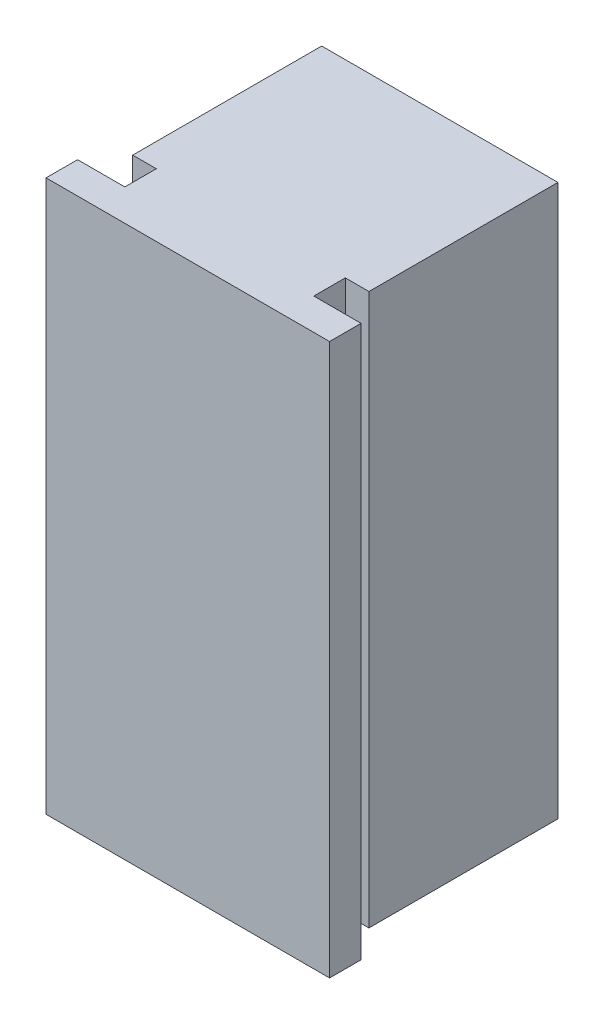
ISO-10303-21;
HEADER;
FILE_DESCRIPTION(('STEP AP214'),'2;1');
FILE_NAME('part.step','',(''),(''),'','','');
FILE_SCHEMA(('AUTOMOTIVE_DESIGN { 1 0 10303 214 1 1 1 1 }'));
ENDSEC;
DATA;
#1=APPLICATION_CONTEXT('core data for automotive mechanical design processes');
#2=APPLICATION_PROTOCOL_DEFINITION('international standard','automotive_design',2000,#1);
#3=PRODUCT_CONTEXT('',#1,'mechanical');
#4=PRODUCT('Part','Part','',(#3));
#5=PRODUCT_RELATED_PRODUCT_CATEGORY('part','',(#4));
#6=PRODUCT_DEFINITION_FORMATION('','',#4);
#7=PRODUCT_DEFINITION_CONTEXT('part definition',#1,'design');
#8=PRODUCT_DEFINITION('design','',#6,#7);
#9=PRODUCT_DEFINITION_SHAPE('','',#8);
#10=(LENGTH_UNIT() NAMED_UNIT(*) SI_UNIT(.MILLI.,.METRE.));
#11=(NAMED_UNIT(*) PLANE_ANGLE_UNIT() SI_UNIT($,.RADIAN.));
#12=(NAMED_UNIT(*) SI_UNIT($,.STERADIAN.) SOLID_ANGLE_UNIT());
#13=UNCERTAINTY_MEASURE_WITH_UNIT(LENGTH_MEASURE(1.E-05),#10,'distance_accuracy_value','');
#14=(GEOMETRIC_REPRESENTATION_CONTEXT(3) GLOBAL_UNCERTAINTY_ASSIGNED_CONTEXT((#13)) GLOBAL_UNIT_ASSIGNED_CONTEXT((#10,
#11,#12)) REPRESENTATION_CONTEXT('',''));
#15=CARTESIAN_POINT('',(0.,0.,0.));
#16=DIRECTION('',(0.,0.,1.));
#17=DIRECTION('',(1.,0.,0.));
#18=AXIS2_PLACEMENT_3D('',#15,#16,#17);
#19=CARTESIAN_POINT('',(0.,35.,3.16129032258062));
#20=DIRECTION('',(0.,0.,-1.));
#21=DIRECTION('',(-1.,0.,0.));
#22=AXIS2_PLACEMENT_3D('',#19,#20,#21);
#23=PLANE('',#22);
#24=CARTESIAN_POINT('',(8.9354838709677,17.5,3.16129032258062));
#25=DIRECTION('',(0.,0.,-1.));
#26=DIRECTION('',(-1.,0.,0.));
#27=AXIS2_PLACEMENT_3D('',#24,#25,#26);
#28=CIRCLE('',#27,4.5);
#29=CARTESIAN_POINT('',(4.4354838709677,17.5,3.16129032258062));
#30=VERTEX_POINT('',#29);
#31=EDGE_CURVE('E253',#30,#30,#28,.T.);
#32=ORIENTED_EDGE('',*,*,#31,.F.);
#33=EDGE_LOOP('',(#32));
#34=FACE_BOUND('',#33,.T.);
#35=DIRECTION('',(1.,0.,0.));
#36=VECTOR('',#35,1.);
#37=CARTESIAN_POINT('',(0.,0.,3.16129032258062));
#38=LINE('',#37,#36);
#39=CARTESIAN_POINT('',(1.4354838709677,0.,3.16129032258062));
#40=VERTEX_POINT('',#39);
#41=CARTESIAN_POINT('',(16.4354838709677,0.,3.16129032258062));
#42=VERTEX_POINT('',#41);
#43=EDGE_CURVE('E161',#40,#42,#38,.T.);
#44=ORIENTED_EDGE('',*,*,#43,.F.);
#45=DIRECTION('',(0.,-1.,0.));
#46=VECTOR('',#45,1.);
#47=CARTESIAN_POINT('',(1.4354838709677,35.,3.16129032258062));
#48=LINE('',#47,#46);
#49=CARTESIAN_POINT('',(1.4354838709677,35.,3.16129032258062));
#50=VERTEX_POINT('',#49);
#51=EDGE_CURVE('E11',#50,#40,#48,.T.);
#52=ORIENTED_EDGE('',*,*,#51,.F.);
#53=DIRECTION('',(1.,0.,0.));
#54=VECTOR('',#53,1.);
#55=CARTESIAN_POINT('',(0.,35.,3.16129032258062));
#56=LINE('',#55,#54);
#57=CARTESIAN_POINT('',(16.4354838709677,35.,3.16129032258062));
#58=VERTEX_POINT('',#57);
#59=EDGE_CURVE('E204',#50,#58,#56,.T.);
#60=ORIENTED_EDGE('',*,*,#59,.T.);
#61=DIRECTION('',(0.,-1.,0.));
#62=VECTOR('',#61,1.);
#63=CARTESIAN_POINT('',(16.4354838709677,35.,3.16129032258062));
#64=LINE('',#63,#62);
#65=EDGE_CURVE('E105',#58,#42,#64,.T.);
#66=ORIENTED_EDGE('',*,*,#65,.T.);
#67=EDGE_LOOP('',(#44,#52,#60,#66));
#68=FACE_BOUND('',#67,.T.);
#69=ADVANCED_FACE('F41',(#34,#68),#23,.T.);
#70=CARTESIAN_POINT('',(1.4354838709677,35.,0.));
#71=DIRECTION('',(-1.,0.,0.));
#72=DIRECTION('',(0.,0.,1.));
#73=AXIS2_PLACEMENT_3D('',#70,#71,#72);
#74=PLANE('',#73);
#75=DIRECTION('',(0.,0.,-1.));
#76=VECTOR('',#75,1.);
#77=CARTESIAN_POINT('',(1.4354838709677,0.,0.));
#78=LINE('',#77,#76);
#79=CARTESIAN_POINT('',(1.43548387096771,0.,15.1612903225806));
#80=VERTEX_POINT('',#79);
#81=EDGE_CURVE('E165',#80,#40,#78,.T.);
#82=ORIENTED_EDGE('',*,*,#81,.F.);
#83=DIRECTION('',(0.,-1.,0.));
#84=VECTOR('',#83,1.);
#85=CARTESIAN_POINT('',(1.43548387096771,35.,15.1612903225806));
#86=LINE('',#85,#84);
#87=CARTESIAN_POINT('',(1.43548387096771,35.,15.1612903225806));
#88=VERTEX_POINT('',#87);
#89=EDGE_CURVE('E50',#88,#80,#86,.T.);
#90=ORIENTED_EDGE('',*,*,#89,.F.);
#91=DIRECTION('',(0.,0.,-1.));
#92=VECTOR('',#91,1.);
#93=CARTESIAN_POINT('',(1.4354838709677,35.,0.));
#94=LINE('',#93,#92);
#95=EDGE_CURVE('E244',#88,#50,#94,.T.);
#96=ORIENTED_EDGE('',*,*,#95,.T.);
#97=ORIENTED_EDGE('',*,*,#51,.T.);
#98=EDGE_LOOP('',(#82,#90,#96,#97));
#99=FACE_BOUND('',#98,.T.);
#100=ADVANCED_FACE('F243',(#99),#74,.T.);
#101=CARTESIAN_POINT('',(0.,35.,15.1612903225806));
#102=DIRECTION('',(0.,0.,-1.));
#103=DIRECTION('',(-1.,0.,0.));
#104=AXIS2_PLACEMENT_3D('',#101,#102,#103);
#105=PLANE('',#104);
#106=DIRECTION('',(1.,0.,0.));
#107=VECTOR('',#106,1.);
#108=CARTESIAN_POINT('',(0.,0.,15.1612903225806));
#109=LINE('',#108,#107);
#110=CARTESIAN_POINT('',(2.93548387096771,0.,15.1612903225806));
#111=VERTEX_POINT('',#110);
#112=EDGE_CURVE('E170',#80,#111,#109,.T.);
#113=ORIENTED_EDGE('',*,*,#112,.T.);
#114=DIRECTION('',(0.,-1.,0.));
#115=VECTOR('',#114,1.);
#116=CARTESIAN_POINT('',(2.93548387096771,35.,15.1612903225806));
#117=LINE('',#116,#115);
#118=CARTESIAN_POINT('',(2.93548387096771,35.,15.1612903225806));
#119=VERTEX_POINT('',#118);
#120=EDGE_CURVE('E227',#119,#111,#117,.T.);
#121=ORIENTED_EDGE('',*,*,#120,.F.);
#122=DIRECTION('',(1.,0.,0.));
#123=VECTOR('',#122,1.);
#124=CARTESIAN_POINT('',(0.,35.,15.1612903225806));
#125=LINE('',#124,#123);
#126=EDGE_CURVE('E235',#88,#119,#125,.T.);
#127=ORIENTED_EDGE('',*,*,#126,.F.);
#128=ORIENTED_EDGE('',*,*,#89,.T.);
#129=EDGE_LOOP('',(#113,#121,#127,#128));
#130=FACE_BOUND('',#129,.T.);
#131=ADVANCED_FACE('F233',(#130),#105,.F.);
#132=CARTESIAN_POINT('',(2.93548387096771,35.,0.));
#133=DIRECTION('',(-1.,0.,0.));
#134=DIRECTION('',(0.,0.,1.));
#135=AXIS2_PLACEMENT_3D('',#132,#133,#134);
#136=PLANE('',#135);
#137=DIRECTION('',(0.,0.,-1.));
#138=VECTOR('',#137,1.);
#139=CARTESIAN_POINT('',(2.93548387096771,0.,0.));
#140=LINE('',#139,#138);
#141=CARTESIAN_POINT('',(2.93548387096771,0.,17.1612903225806));
#142=VERTEX_POINT('',#141);
#143=EDGE_CURVE('E174',#142,#111,#140,.T.);
#144=ORIENTED_EDGE('',*,*,#143,.F.);
#145=DIRECTION('',(0.,-1.,0.));
#146=VECTOR('',#145,1.);
#147=CARTESIAN_POINT('',(2.93548387096771,35.,17.1612903225806));
#148=LINE('',#147,#146);
#149=CARTESIAN_POINT('',(2.93548387096771,35.,17.1612903225806));
#150=VERTEX_POINT('',#149);
#151=EDGE_CURVE('E224',#150,#142,#148,.T.);
#152=ORIENTED_EDGE('',*,*,#151,.F.);
#153=DIRECTION('',(0.,0.,-1.));
#154=VECTOR('',#153,1.);
#155=CARTESIAN_POINT('',(2.93548387096771,35.,0.));
#156=LINE('',#155,#154);
#157=EDGE_CURVE('E258',#150,#119,#156,.T.);
#158=ORIENTED_EDGE('',*,*,#157,.T.);
#159=ORIENTED_EDGE('',*,*,#120,.T.);
#160=EDGE_LOOP('',(#144,#152,#158,#159));
#161=FACE_BOUND('',#160,.T.);
#162=ADVANCED_FACE('F299',(#161),#136,.T.);
#163=CARTESIAN_POINT('',(0.,35.,17.1612903225806));
#164=DIRECTION('',(0.,0.,-1.));
#165=DIRECTION('',(-1.,0.,0.));
#166=AXIS2_PLACEMENT_3D('',#163,#164,#165);
#167=PLANE('',#166);
#168=DIRECTION('',(1.,0.,0.));
#169=VECTOR('',#168,1.);
#170=CARTESIAN_POINT('',(0.,0.,17.1612903225806));
#171=LINE('',#170,#169);
#172=CARTESIAN_POINT('',(-0.0645161290322924,0.,17.1612903225806));
#173=VERTEX_POINT('',#172);
#174=EDGE_CURVE('E178',#173,#142,#171,.T.);
#175=ORIENTED_EDGE('',*,*,#174,.F.);
#176=DIRECTION('',(0.,-1.,0.));
#177=VECTOR('',#176,1.);
#178=CARTESIAN_POINT('',(-0.0645161290322924,35.,17.1612903225806));
#179=LINE('',#178,#177);
#180=CARTESIAN_POINT('',(-0.0645161290322924,35.,17.1612903225806));
#181=VERTEX_POINT('',#180);
#182=EDGE_CURVE('E221',#181,#173,#179,.T.);
#183=ORIENTED_EDGE('',*,*,#182,.F.);
#184=DIRECTION('',(1.,0.,0.));
#185=VECTOR('',#184,1.);
#186=CARTESIAN_POINT('',(0.,35.,17.1612903225806));
#187=LINE('',#186,#185);
#188=EDGE_CURVE('E262',#181,#150,#187,.T.);
#189=ORIENTED_EDGE('',*,*,#188,.T.);
#190=ORIENTED_EDGE('',*,*,#151,.T.);
#191=EDGE_LOOP('',(#175,#183,#189,#190));
#192=FACE_BOUND('',#191,.T.);
#193=ADVANCED_FACE('F295',(#192),#167,.T.);
#194=CARTESIAN_POINT('',(-0.0645161290322924,35.,0.));
#195=DIRECTION('',(-1.,0.,0.));
#196=DIRECTION('',(0.,0.,1.));
#197=AXIS2_PLACEMENT_3D('',#194,#195,#196);
#198=PLANE('',#197);
#199=DIRECTION('',(0.,0.,-1.));
#200=VECTOR('',#199,1.);
#201=CARTESIAN_POINT('',(-0.0645161290322924,0.,0.));
#202=LINE('',#201,#200);
#203=CARTESIAN_POINT('',(-0.0645161290322924,0.,19.1612903225806));
#204=VERTEX_POINT('',#203);
#205=EDGE_CURVE('E182',#204,#173,#202,.T.);
#206=ORIENTED_EDGE('',*,*,#205,.F.);
#207=DIRECTION('',(0.,-1.,0.));
#208=VECTOR('',#207,1.);
#209=CARTESIAN_POINT('',(-0.0645161290322924,35.,19.1612903225806));
#210=LINE('',#209,#208);
#211=CARTESIAN_POINT('',(-0.0645161290322924,35.,19.1612903225806));
#212=VERTEX_POINT('',#211);
#213=EDGE_CURVE('E218',#212,#204,#210,.T.);
#214=ORIENTED_EDGE('',*,*,#213,.F.);
#215=DIRECTION('',(0.,0.,-1.));
#216=VECTOR('',#215,1.);
#217=CARTESIAN_POINT('',(-0.0645161290322924,35.,0.));
#218=LINE('',#217,#216);
#219=EDGE_CURVE('E266',#212,#181,#218,.T.);
#220=ORIENTED_EDGE('',*,*,#219,.T.);
#221=ORIENTED_EDGE('',*,*,#182,.T.);
#222=EDGE_LOOP('',(#206,#214,#220,#221));
#223=FACE_BOUND('',#222,.T.);
#224=ADVANCED_FACE('F292',(#223),#198,.T.);
#225=CARTESIAN_POINT('',(0.,35.,19.1612903225806));
#226=DIRECTION('',(0.,0.,-1.));
#227=DIRECTION('',(-1.,0.,0.));
#228=AXIS2_PLACEMENT_3D('',#225,#226,#227);
#229=PLANE('',#228);
#230=DIRECTION('',(1.,0.,0.));
#231=VECTOR('',#230,1.);
#232=CARTESIAN_POINT('',(0.,0.,19.1612903225806));
#233=LINE('',#232,#231);
#234=CARTESIAN_POINT('',(17.9354838709677,0.,19.1612903225806));
#235=VERTEX_POINT('',#234);
#236=EDGE_CURVE('E186',#204,#235,#233,.T.);
#237=ORIENTED_EDGE('',*,*,#236,.T.);
#238=DIRECTION('',(0.,-1.,0.));
#239=VECTOR('',#238,1.);
#240=CARTESIAN_POINT('',(17.9354838709677,35.,19.1612903225806));
#241=LINE('',#240,#239);
#242=CARTESIAN_POINT('',(17.9354838709677,35.,19.1612903225806));
#243=VERTEX_POINT('',#242);
#244=EDGE_CURVE('E214',#243,#235,#241,.T.);
#245=ORIENTED_EDGE('',*,*,#244,.F.);
#246=DIRECTION('',(1.,0.,0.));
#247=VECTOR('',#246,1.);
#248=CARTESIAN_POINT('',(0.,35.,19.1612903225806));
#249=LINE('',#248,#247);
#250=EDGE_CURVE('E270',#212,#243,#249,.T.);
#251=ORIENTED_EDGE('',*,*,#250,.F.);
#252=ORIENTED_EDGE('',*,*,#213,.T.);
#253=EDGE_LOOP('',(#237,#245,#251,#252));
#254=FACE_BOUND('',#253,.T.);
#255=ADVANCED_FACE('F289',(#254),#229,.F.);
#256=CARTESIAN_POINT('',(17.9354838709677,35.,0.));
#257=DIRECTION('',(-1.,0.,0.));
#258=DIRECTION('',(0.,0.,1.));
#259=AXIS2_PLACEMENT_3D('',#256,#257,#258);
#260=PLANE('',#259);
#261=DIRECTION('',(0.,0.,-1.));
#262=VECTOR('',#261,1.);
#263=CARTESIAN_POINT('',(17.9354838709677,0.,0.));
#264=LINE('',#263,#262);
#265=CARTESIAN_POINT('',(17.9354838709677,0.,17.1612903225806));
#266=VERTEX_POINT('',#265);
#267=EDGE_CURVE('E189',#235,#266,#264,.T.);
#268=ORIENTED_EDGE('',*,*,#267,.T.);
#269=DIRECTION('',(0.,-1.,0.));
#270=VECTOR('',#269,1.);
#271=CARTESIAN_POINT('',(17.9354838709677,35.,17.1612903225806));
#272=LINE('',#271,#270);
#273=CARTESIAN_POINT('',(17.9354838709677,35.,17.1612903225806));
#274=VERTEX_POINT('',#273);
#275=EDGE_CURVE('E211',#274,#266,#272,.T.);
#276=ORIENTED_EDGE('',*,*,#275,.F.);
#277=DIRECTION('',(0.,0.,-1.));
#278=VECTOR('',#277,1.);
#279=CARTESIAN_POINT('',(17.9354838709677,35.,0.));
#280=LINE('',#279,#278);
#281=EDGE_CURVE('E273',#243,#274,#280,.T.);
#282=ORIENTED_EDGE('',*,*,#281,.F.);
#283=ORIENTED_EDGE('',*,*,#244,.T.);
#284=EDGE_LOOP('',(#268,#276,#282,#283));
#285=FACE_BOUND('',#284,.T.);
#286=ADVANCED_FACE('F284',(#285),#260,.F.);
#287=CARTESIAN_POINT('',(0.,35.,17.1612903225806));
#288=DIRECTION('',(0.,0.,-1.));
#289=DIRECTION('',(-1.,0.,0.));
#290=AXIS2_PLACEMENT_3D('',#287,#288,#289);
#291=PLANE('',#290);
#292=DIRECTION('',(1.,0.,0.));
#293=VECTOR('',#292,1.);
#294=CARTESIAN_POINT('',(0.,0.,17.1612903225806));
#295=LINE('',#294,#293);
#296=CARTESIAN_POINT('',(14.9354838709677,0.,17.1612903225806));
#297=VERTEX_POINT('',#296);
#298=EDGE_CURVE('E193',#297,#266,#295,.T.);
#299=ORIENTED_EDGE('',*,*,#298,.F.);
#300=DIRECTION('',(0.,-1.,0.));
#301=VECTOR('',#300,1.);
#302=CARTESIAN_POINT('',(14.9354838709677,35.,17.1612903225806));
#303=LINE('',#302,#301);
#304=CARTESIAN_POINT('',(14.9354838709677,35.,17.1612903225806));
#305=VERTEX_POINT('',#304);
#306=EDGE_CURVE('E151',#305,#297,#303,.T.);
#307=ORIENTED_EDGE('',*,*,#306,.F.);
#308=DIRECTION('',(1.,0.,0.));
#309=VECTOR('',#308,1.);
#310=CARTESIAN_POINT('',(0.,35.,17.1612903225806));
#311=LINE('',#310,#309);
#312=EDGE_CURVE('E142',#305,#274,#311,.T.);
#313=ORIENTED_EDGE('',*,*,#312,.T.);
#314=ORIENTED_EDGE('',*,*,#275,.T.);
#315=EDGE_LOOP('',(#299,#307,#313,#314));
#316=FACE_BOUND('',#315,.T.);
#317=ADVANCED_FACE('F278',(#316),#291,.T.);
#318=CARTESIAN_POINT('',(14.9354838709677,35.,0.));
#319=DIRECTION('',(-1.,0.,0.));
#320=DIRECTION('',(0.,0.,1.));
#321=AXIS2_PLACEMENT_3D('',#318,#319,#320);
#322=PLANE('',#321);
#323=DIRECTION('',(0.,0.,-1.));
#324=VECTOR('',#323,1.);
#325=CARTESIAN_POINT('',(14.9354838709677,0.,0.));
#326=LINE('',#325,#324);
#327=CARTESIAN_POINT('',(14.9354838709677,0.,15.1612903225806));
#328=VERTEX_POINT('',#327);
#329=EDGE_CURVE('E149',#297,#328,#326,.T.);
#330=ORIENTED_EDGE('',*,*,#329,.T.);
#331=DIRECTION('',(0.,-1.,0.));
#332=VECTOR('',#331,1.);
#333=CARTESIAN_POINT('',(14.9354838709677,35.,15.1612903225806));
#334=LINE('',#333,#332);
#335=CARTESIAN_POINT('',(14.9354838709677,35.,15.1612903225806));
#336=VERTEX_POINT('',#335);
#337=EDGE_CURVE('E146',#336,#328,#334,.T.);
#338=ORIENTED_EDGE('',*,*,#337,.F.);
#339=DIRECTION('',(0.,0.,-1.));
#340=VECTOR('',#339,1.);
#341=CARTESIAN_POINT('',(14.9354838709677,35.,0.));
#342=LINE('',#341,#340);
#343=EDGE_CURVE('E136',#305,#336,#342,.T.);
#344=ORIENTED_EDGE('',*,*,#343,.F.);
#345=ORIENTED_EDGE('',*,*,#306,.T.);
#346=EDGE_LOOP('',(#330,#338,#344,#345));
#347=FACE_BOUND('',#346,.T.);
#348=ADVANCED_FACE('F147',(#347),#322,.F.);
#349=CARTESIAN_POINT('',(0.,35.,15.1612903225806));
#350=DIRECTION('',(0.,0.,-1.));
#351=DIRECTION('',(-1.,0.,0.));
#352=AXIS2_PLACEMENT_3D('',#349,#350,#351);
#353=PLANE('',#352);
#354=DIRECTION('',(1.,0.,0.));
#355=VECTOR('',#354,1.);
#356=CARTESIAN_POINT('',(0.,0.,15.1612903225806));
#357=LINE('',#356,#355);
#358=CARTESIAN_POINT('',(16.4354838709677,0.,15.1612903225806));
#359=VERTEX_POINT('',#358);
#360=EDGE_CURVE('E98',#328,#359,#357,.T.);
#361=ORIENTED_EDGE('',*,*,#360,.T.);
#362=DIRECTION('',(0.,-1.,0.));
#363=VECTOR('',#362,1.);
#364=CARTESIAN_POINT('',(16.4354838709677,35.,15.1612903225806));
#365=LINE('',#364,#363);
#366=CARTESIAN_POINT('',(16.4354838709677,35.,15.1612903225806));
#367=VERTEX_POINT('',#366);
#368=EDGE_CURVE('E152',#367,#359,#365,.T.);
#369=ORIENTED_EDGE('',*,*,#368,.F.);
#370=DIRECTION('',(1.,0.,0.));
#371=VECTOR('',#370,1.);
#372=CARTESIAN_POINT('',(0.,35.,15.1612903225806));
#373=LINE('',#372,#371);
#374=EDGE_CURVE('E140',#336,#367,#373,.T.);
#375=ORIENTED_EDGE('',*,*,#374,.F.);
#376=ORIENTED_EDGE('',*,*,#337,.T.);
#377=EDGE_LOOP('',(#361,#369,#375,#376));
#378=FACE_BOUND('',#377,.T.);
#379=ADVANCED_FACE('F154',(#378),#353,.F.);
#380=CARTESIAN_POINT('',(16.4354838709677,35.,0.));
#381=DIRECTION('',(-1.,0.,0.));
#382=DIRECTION('',(0.,0.,1.));
#383=AXIS2_PLACEMENT_3D('',#380,#381,#382);
#384=PLANE('',#383);
#385=DIRECTION('',(0.,0.,-1.));
#386=VECTOR('',#385,1.);
#387=CARTESIAN_POINT('',(16.4354838709677,0.,0.));
#388=LINE('',#387,#386);
#389=EDGE_CURVE('E201',#359,#42,#388,.T.);
#390=ORIENTED_EDGE('',*,*,#389,.T.);
#391=ORIENTED_EDGE('',*,*,#65,.F.);
#392=DIRECTION('',(0.,0.,-1.));
#393=VECTOR('',#392,1.);
#394=CARTESIAN_POINT('',(16.4354838709677,35.,0.));
#395=LINE('',#394,#393);
#396=EDGE_CURVE('E58',#367,#58,#395,.T.);
#397=ORIENTED_EDGE('',*,*,#396,.F.);
#398=ORIENTED_EDGE('',*,*,#368,.T.);
#399=EDGE_LOOP('',(#390,#391,#397,#398));
#400=FACE_BOUND('',#399,.T.);
#401=ADVANCED_FACE('F247',(#400),#384,.F.);
#402=CARTESIAN_POINT('',(0.,35.,0.));
#403=DIRECTION('',(0.,1.,0.));
#404=DIRECTION('',(0.,0.,1.));
#405=AXIS2_PLACEMENT_3D('',#402,#403,#404);
#406=PLANE('',#405);
#407=ORIENTED_EDGE('',*,*,#59,.F.);
#408=ORIENTED_EDGE('',*,*,#95,.F.);
#409=ORIENTED_EDGE('',*,*,#126,.T.);
#410=ORIENTED_EDGE('',*,*,#157,.F.);
#411=ORIENTED_EDGE('',*,*,#188,.F.);
#412=ORIENTED_EDGE('',*,*,#219,.F.);
#413=ORIENTED_EDGE('',*,*,#250,.T.);
#414=ORIENTED_EDGE('',*,*,#281,.T.);
#415=ORIENTED_EDGE('',*,*,#312,.F.);
#416=ORIENTED_EDGE('',*,*,#343,.T.);
#417=ORIENTED_EDGE('',*,*,#374,.T.);
#418=ORIENTED_EDGE('',*,*,#396,.T.);
#419=EDGE_LOOP('',(#407,#408,#409,#410,#411,#412,#413,#414,#415,#416,#417,#418));
#420=FACE_BOUND('',#419,.T.);
#421=ADVANCED_FACE('F138',(#420),#406,.T.);
#422=CARTESIAN_POINT('',(0.,0.,0.));
#423=DIRECTION('',(0.,1.,0.));
#424=DIRECTION('',(0.,0.,1.));
#425=AXIS2_PLACEMENT_3D('',#422,#423,#424);
#426=PLANE('',#425);
#427=ORIENTED_EDGE('',*,*,#43,.T.);
#428=ORIENTED_EDGE('',*,*,#389,.F.);
#429=ORIENTED_EDGE('',*,*,#360,.F.);
#430=ORIENTED_EDGE('',*,*,#329,.F.);
#431=ORIENTED_EDGE('',*,*,#298,.T.);
#432=ORIENTED_EDGE('',*,*,#267,.F.);
#433=ORIENTED_EDGE('',*,*,#236,.F.);
#434=ORIENTED_EDGE('',*,*,#205,.T.);
#435=ORIENTED_EDGE('',*,*,#174,.T.);
#436=ORIENTED_EDGE('',*,*,#143,.T.);
#437=ORIENTED_EDGE('',*,*,#112,.F.);
#438=ORIENTED_EDGE('',*,*,#81,.T.);
#439=EDGE_LOOP('',(#427,#428,#429,#430,#431,#432,#433,#434,#435,#436,#437,#438));
#440=FACE_BOUND('',#439,.T.);
#441=ADVANCED_FACE('F241',(#440),#426,.F.);
#442=CARTESIAN_POINT('',(8.9354838709677,17.5,15.1612903225806));
#443=DIRECTION('',(0.,0.,-1.));
#444=DIRECTION('',(-1.,0.,0.));
#445=AXIS2_PLACEMENT_3D('',#442,#443,#444);
#446=CYLINDRICAL_SURFACE('',#445,4.5);
#447=CARTESIAN_POINT('',(8.9354838709677,17.5,15.1612903225806));
#448=DIRECTION('',(0.,0.,-1.));
#449=DIRECTION('',(-1.,0.,0.));
#450=AXIS2_PLACEMENT_3D('',#447,#448,#449);
#451=CIRCLE('',#450,4.5);
#452=CARTESIAN_POINT('',(4.4354838709677,17.5,15.1612903225806));
#453=VERTEX_POINT('',#452);
#454=EDGE_CURVE('E166',#453,#453,#451,.T.);
#455=ORIENTED_EDGE('',*,*,#454,.F.);
#456=EDGE_LOOP('',(#455));
#457=FACE_BOUND('',#456,.T.);
#458=ORIENTED_EDGE('',*,*,#31,.T.);
#459=EDGE_LOOP('',(#458));
#460=FACE_BOUND('',#459,.T.);
#461=ADVANCED_FACE('F323',(#457,#460),#446,.F.);
#462=CARTESIAN_POINT('',(8.9354838709677,17.5,15.1612903225806));
#463=DIRECTION('',(0.,0.,-1.));
#464=DIRECTION('',(-1.,0.,0.));
#465=AXIS2_PLACEMENT_3D('',#462,#463,#464);
#466=PLANE('',#465);
#467=ORIENTED_EDGE('',*,*,#454,.T.);
#468=EDGE_LOOP('',(#467));
#469=FACE_BOUND('',#468,.T.);
#470=ADVANCED_FACE('F321',(#469),#466,.T.);
#471=CLOSED_SHELL('',(#69,#100,#131,#162,#193,#224,#255,#286,#317,#348,#379,#401,#421,#441,#461,#470));
#472=MANIFOLD_SOLID_BREP('B2',#471);
#473=ADVANCED_BREP_SHAPE_REPRESENTATION('',(#18,#472),#14);
#474=SHAPE_DEFINITION_REPRESENTATION(#9,#473);
ENDSEC;
END-ISO-10303-21;
